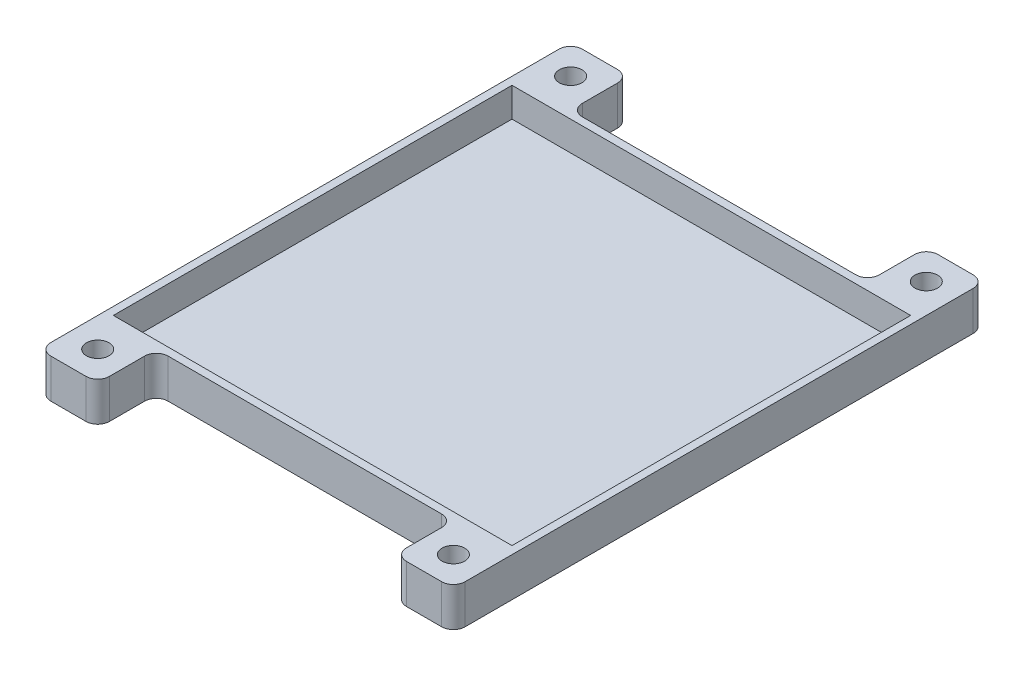
ISO-10303-21;
HEADER;
FILE_DESCRIPTION(('STEP AP214'),'2;1');
FILE_NAME('part.step','',(''),(''),'','','');
FILE_SCHEMA(('AUTOMOTIVE_DESIGN { 1 0 10303 214 1 1 1 1 }'));
ENDSEC;
DATA;
#1=APPLICATION_CONTEXT('core data for automotive mechanical design processes');
#2=APPLICATION_PROTOCOL_DEFINITION('international standard','automotive_design',2000,#1);
#3=PRODUCT_CONTEXT('',#1,'mechanical');
#4=PRODUCT('Part','Part','',(#3));
#5=PRODUCT_RELATED_PRODUCT_CATEGORY('part','',(#4));
#6=PRODUCT_DEFINITION_FORMATION('','',#4);
#7=PRODUCT_DEFINITION_CONTEXT('part definition',#1,'design');
#8=PRODUCT_DEFINITION('design','',#6,#7);
#9=PRODUCT_DEFINITION_SHAPE('','',#8);
#10=(LENGTH_UNIT() NAMED_UNIT(*) SI_UNIT(.MILLI.,.METRE.));
#11=(NAMED_UNIT(*) PLANE_ANGLE_UNIT() SI_UNIT($,.RADIAN.));
#12=(NAMED_UNIT(*) SI_UNIT($,.STERADIAN.) SOLID_ANGLE_UNIT());
#13=UNCERTAINTY_MEASURE_WITH_UNIT(LENGTH_MEASURE(1.E-05),#10,'distance_accuracy_value','');
#14=(GEOMETRIC_REPRESENTATION_CONTEXT(3) GLOBAL_UNCERTAINTY_ASSIGNED_CONTEXT((#13)) GLOBAL_UNIT_ASSIGNED_CONTEXT((#10,
#11,#12)) REPRESENTATION_CONTEXT('',''));
#15=CARTESIAN_POINT('',(0.,0.,0.));
#16=DIRECTION('',(0.,0.,1.));
#17=DIRECTION('',(1.,0.,0.));
#18=AXIS2_PLACEMENT_3D('',#15,#16,#17);
#19=CARTESIAN_POINT('',(-53.,-8.5,-51.));
#20=DIRECTION('',(0.,0.,-1.));
#21=DIRECTION('',(-1.,0.,0.));
#22=AXIS2_PLACEMENT_3D('',#19,#20,#21);
#23=PLANE('',#22);
#24=DIRECTION('',(1.,0.,0.));
#25=VECTOR('',#24,1.);
#26=CARTESIAN_POINT('',(51.,-6.00000000000001,-51.));
#27=LINE('',#26,#25);
#28=CARTESIAN_POINT('',(-51.,-6.,-51.));
#29=VERTEX_POINT('',#28);
#30=CARTESIAN_POINT('',(51.,-6.00000000000001,-51.));
#31=VERTEX_POINT('',#30);
#32=EDGE_CURVE('E445',#29,#31,#27,.T.);
#33=ORIENTED_EDGE('',*,*,#32,.T.);
#34=DIRECTION('',(0.,1.,0.));
#35=VECTOR('',#34,1.);
#36=CARTESIAN_POINT('',(51.,-8.5,-51.));
#37=LINE('',#36,#35);
#38=CARTESIAN_POINT('',(51.,1.5,-51.));
#39=VERTEX_POINT('',#38);
#40=EDGE_CURVE('E431',#31,#39,#37,.T.);
#41=ORIENTED_EDGE('',*,*,#40,.T.);
#42=DIRECTION('',(-1.,0.,0.));
#43=VECTOR('',#42,1.);
#44=CARTESIAN_POINT('',(51.,1.5,-51.));
#45=LINE('',#44,#43);
#46=CARTESIAN_POINT('',(-51.,1.5,-51.));
#47=VERTEX_POINT('',#46);
#48=EDGE_CURVE('E469',#39,#47,#45,.T.);
#49=ORIENTED_EDGE('',*,*,#48,.T.);
#50=DIRECTION('',(0.,1.,0.));
#51=VECTOR('',#50,1.);
#52=CARTESIAN_POINT('',(-51.,-8.5,-51.));
#53=LINE('',#52,#51);
#54=EDGE_CURVE('E441',#29,#47,#53,.T.);
#55=ORIENTED_EDGE('',*,*,#54,.F.);
#56=EDGE_LOOP('',(#33,#41,#49,#55));
#57=FACE_BOUND('',#56,.T.);
#58=ADVANCED_FACE('F247',(#57),#23,.F.);
#59=CARTESIAN_POINT('',(-51.,-8.5,53.));
#60=DIRECTION('',(-1.,0.,0.));
#61=DIRECTION('',(0.,0.,1.));
#62=AXIS2_PLACEMENT_3D('',#59,#60,#61);
#63=PLANE('',#62);
#64=DIRECTION('',(0.,0.,-1.));
#65=VECTOR('',#64,1.);
#66=CARTESIAN_POINT('',(-51.,-6.00000000000001,-51.));
#67=LINE('',#66,#65);
#68=CARTESIAN_POINT('',(-51.,-6.,51.));
#69=VERTEX_POINT('',#68);
#70=EDGE_CURVE('E262',#69,#29,#67,.T.);
#71=ORIENTED_EDGE('',*,*,#70,.T.);
#72=ORIENTED_EDGE('',*,*,#54,.T.);
#73=DIRECTION('',(0.,0.,1.));
#74=VECTOR('',#73,1.);
#75=CARTESIAN_POINT('',(-51.,1.5,-51.));
#76=LINE('',#75,#74);
#77=CARTESIAN_POINT('',(-51.,1.5,51.));
#78=VERTEX_POINT('',#77);
#79=EDGE_CURVE('E471',#47,#78,#76,.T.);
#80=ORIENTED_EDGE('',*,*,#79,.T.);
#81=DIRECTION('',(0.,1.,0.));
#82=VECTOR('',#81,1.);
#83=CARTESIAN_POINT('',(-51.,-8.5,51.));
#84=LINE('',#83,#82);
#85=EDGE_CURVE('E547',#69,#78,#84,.T.);
#86=ORIENTED_EDGE('',*,*,#85,.F.);
#87=EDGE_LOOP('',(#71,#72,#80,#86));
#88=FACE_BOUND('',#87,.T.);
#89=ADVANCED_FACE('F788',(#88),#63,.F.);
#90=CARTESIAN_POINT('',(-53.,-8.5,51.));
#91=DIRECTION('',(0.,0.,1.));
#92=DIRECTION('',(1.,0.,0.));
#93=AXIS2_PLACEMENT_3D('',#90,#91,#92);
#94=PLANE('',#93);
#95=DIRECTION('',(-1.,0.,0.));
#96=VECTOR('',#95,1.);
#97=CARTESIAN_POINT('',(-51.,-6.00000000000001,51.));
#98=LINE('',#97,#96);
#99=CARTESIAN_POINT('',(51.,-6.,51.));
#100=VERTEX_POINT('',#99);
#101=EDGE_CURVE('E270',#100,#69,#98,.T.);
#102=ORIENTED_EDGE('',*,*,#101,.T.);
#103=ORIENTED_EDGE('',*,*,#85,.T.);
#104=DIRECTION('',(1.,0.,0.));
#105=VECTOR('',#104,1.);
#106=CARTESIAN_POINT('',(-51.,1.5,51.));
#107=LINE('',#106,#105);
#108=CARTESIAN_POINT('',(51.,1.5,51.));
#109=VERTEX_POINT('',#108);
#110=EDGE_CURVE('E465',#78,#109,#107,.T.);
#111=ORIENTED_EDGE('',*,*,#110,.T.);
#112=DIRECTION('',(0.,1.,0.));
#113=VECTOR('',#112,1.);
#114=CARTESIAN_POINT('',(51.,-8.5,51.));
#115=LINE('',#114,#113);
#116=EDGE_CURVE('E545',#100,#109,#115,.T.);
#117=ORIENTED_EDGE('',*,*,#116,.F.);
#118=EDGE_LOOP('',(#102,#103,#111,#117));
#119=FACE_BOUND('',#118,.T.);
#120=ADVANCED_FACE('F794',(#119),#94,.F.);
#121=CARTESIAN_POINT('',(51.,-8.5,53.));
#122=DIRECTION('',(1.,0.,0.));
#123=DIRECTION('',(0.,0.,-1.));
#124=AXIS2_PLACEMENT_3D('',#121,#122,#123);
#125=PLANE('',#124);
#126=DIRECTION('',(0.,0.,1.));
#127=VECTOR('',#126,1.);
#128=CARTESIAN_POINT('',(51.,-6.00000000000001,51.));
#129=LINE('',#128,#127);
#130=EDGE_CURVE('E435',#31,#100,#129,.T.);
#131=ORIENTED_EDGE('',*,*,#130,.T.);
#132=ORIENTED_EDGE('',*,*,#116,.T.);
#133=DIRECTION('',(0.,0.,-1.));
#134=VECTOR('',#133,1.);
#135=CARTESIAN_POINT('',(51.,1.5,51.));
#136=LINE('',#135,#134);
#137=EDGE_CURVE('E437',#109,#39,#136,.T.);
#138=ORIENTED_EDGE('',*,*,#137,.T.);
#139=ORIENTED_EDGE('',*,*,#40,.F.);
#140=EDGE_LOOP('',(#131,#132,#138,#139));
#141=FACE_BOUND('',#140,.T.);
#142=ADVANCED_FACE('F433',(#141),#125,.F.);
#143=CARTESIAN_POINT('',(-53.,-8.5,53.));
#144=DIRECTION('',(0.,0.,1.));
#145=DIRECTION('',(1.,0.,0.));
#146=AXIS2_PLACEMENT_3D('',#143,#144,#145);
#147=PLANE('',#146);
#148=DIRECTION('',(1.,0.,0.));
#149=VECTOR('',#148,1.);
#150=CARTESIAN_POINT('',(-53.,-8.5,53.));
#151=LINE('',#150,#149);
#152=CARTESIAN_POINT('',(-35.,-8.5,53.));
#153=VERTEX_POINT('',#152);
#154=CARTESIAN_POINT('',(35.,-8.5,53.));
#155=VERTEX_POINT('',#154);
#156=EDGE_CURVE('E559',#153,#155,#151,.T.);
#157=ORIENTED_EDGE('',*,*,#156,.T.);
#158=DIRECTION('',(0.,-1.,0.));
#159=VECTOR('',#158,1.);
#160=CARTESIAN_POINT('',(35.,-8.5,53.));
#161=LINE('',#160,#159);
#162=CARTESIAN_POINT('',(35.,1.5,53.));
#163=VERTEX_POINT('',#162);
#164=EDGE_CURVE('E652',#155,#163,#161,.F.);
#165=ORIENTED_EDGE('',*,*,#164,.T.);
#166=DIRECTION('',(1.,0.,0.));
#167=VECTOR('',#166,1.);
#168=CARTESIAN_POINT('',(-38.,1.5,53.));
#169=LINE('',#168,#167);
#170=CARTESIAN_POINT('',(-35.,1.5,53.));
#171=VERTEX_POINT('',#170);
#172=EDGE_CURVE('E477',#171,#163,#169,.T.);
#173=ORIENTED_EDGE('',*,*,#172,.F.);
#174=DIRECTION('',(0.,-1.,0.));
#175=VECTOR('',#174,1.);
#176=CARTESIAN_POINT('',(-35.,-8.5,53.));
#177=LINE('',#176,#175);
#178=EDGE_CURVE('E649',#171,#153,#177,.T.);
#179=ORIENTED_EDGE('',*,*,#178,.T.);
#180=EDGE_LOOP('',(#157,#165,#173,#179));
#181=FACE_BOUND('',#180,.T.);
#182=ADVANCED_FACE('F684',(#181),#147,.T.);
#183=CARTESIAN_POINT('',(-53.,-8.5,-53.));
#184=DIRECTION('',(0.,0.,-1.));
#185=DIRECTION('',(-1.,0.,0.));
#186=AXIS2_PLACEMENT_3D('',#183,#184,#185);
#187=PLANE('',#186);
#188=DIRECTION('',(-1.,0.,0.));
#189=VECTOR('',#188,1.);
#190=CARTESIAN_POINT('',(-53.,-8.5,-53.));
#191=LINE('',#190,#189);
#192=CARTESIAN_POINT('',(35.,-8.5,-53.));
#193=VERTEX_POINT('',#192);
#194=CARTESIAN_POINT('',(-35.,-8.5,-53.));
#195=VERTEX_POINT('',#194);
#196=EDGE_CURVE('E553',#193,#195,#191,.T.);
#197=ORIENTED_EDGE('',*,*,#196,.T.);
#198=DIRECTION('',(0.,-1.,0.));
#199=VECTOR('',#198,1.);
#200=CARTESIAN_POINT('',(-35.,-8.5,-53.));
#201=LINE('',#200,#199);
#202=CARTESIAN_POINT('',(-35.,1.5,-53.));
#203=VERTEX_POINT('',#202);
#204=EDGE_CURVE('E622',#195,#203,#201,.F.);
#205=ORIENTED_EDGE('',*,*,#204,.T.);
#206=DIRECTION('',(-1.,0.,0.));
#207=VECTOR('',#206,1.);
#208=CARTESIAN_POINT('',(38.,1.5,-53.));
#209=LINE('',#208,#207);
#210=CARTESIAN_POINT('',(35.,1.5,-53.));
#211=VERTEX_POINT('',#210);
#212=EDGE_CURVE('E495',#211,#203,#209,.T.);
#213=ORIENTED_EDGE('',*,*,#212,.F.);
#214=DIRECTION('',(0.,-1.,0.));
#215=VECTOR('',#214,1.);
#216=CARTESIAN_POINT('',(35.,-8.5,-53.));
#217=LINE('',#216,#215);
#218=EDGE_CURVE('E619',#211,#193,#217,.T.);
#219=ORIENTED_EDGE('',*,*,#218,.T.);
#220=EDGE_LOOP('',(#197,#205,#213,#219));
#221=FACE_BOUND('',#220,.T.);
#222=ADVANCED_FACE('F737',(#221),#187,.T.);
#223=CARTESIAN_POINT('',(53.,-8.5,53.));
#224=DIRECTION('',(1.,0.,0.));
#225=DIRECTION('',(0.,0.,-1.));
#226=AXIS2_PLACEMENT_3D('',#223,#224,#225);
#227=PLANE('',#226);
#228=DIRECTION('',(0.,0.,-1.));
#229=VECTOR('',#228,1.);
#230=CARTESIAN_POINT('',(53.,-8.5,53.));
#231=LINE('',#230,#229);
#232=CARTESIAN_POINT('',(53.,-8.5,65.));
#233=VERTEX_POINT('',#232);
#234=CARTESIAN_POINT('',(53.,-8.5,-65.));
#235=VERTEX_POINT('',#234);
#236=EDGE_CURVE('E546',#233,#235,#231,.T.);
#237=ORIENTED_EDGE('',*,*,#236,.T.);
#238=DIRECTION('',(0.,-1.,0.));
#239=VECTOR('',#238,1.);
#240=CARTESIAN_POINT('',(53.,1.5,-65.));
#241=LINE('',#240,#239);
#242=CARTESIAN_POINT('',(53.,1.5,-65.));
#243=VERTEX_POINT('',#242);
#244=EDGE_CURVE('E637',#235,#243,#241,.F.);
#245=ORIENTED_EDGE('',*,*,#244,.T.);
#246=DIRECTION('',(0.,0.,-1.));
#247=VECTOR('',#246,1.);
#248=CARTESIAN_POINT('',(53.,1.5,68.));
#249=LINE('',#248,#247);
#250=CARTESIAN_POINT('',(53.,1.5,65.));
#251=VERTEX_POINT('',#250);
#252=EDGE_CURVE('E486',#251,#243,#249,.T.);
#253=ORIENTED_EDGE('',*,*,#252,.F.);
#254=DIRECTION('',(0.,-1.,0.));
#255=VECTOR('',#254,1.);
#256=CARTESIAN_POINT('',(53.,-8.5,65.));
#257=LINE('',#256,#255);
#258=EDGE_CURVE('E634',#251,#233,#257,.T.);
#259=ORIENTED_EDGE('',*,*,#258,.T.);
#260=EDGE_LOOP('',(#237,#245,#253,#259));
#261=FACE_BOUND('',#260,.T.);
#262=ADVANCED_FACE('F710',(#261),#227,.T.);
#263=CARTESIAN_POINT('',(-53.,-8.5,53.));
#264=DIRECTION('',(-1.,0.,0.));
#265=DIRECTION('',(0.,0.,1.));
#266=AXIS2_PLACEMENT_3D('',#263,#264,#265);
#267=PLANE('',#266);
#268=DIRECTION('',(0.,0.,1.));
#269=VECTOR('',#268,1.);
#270=CARTESIAN_POINT('',(-53.,-8.5,53.));
#271=LINE('',#270,#269);
#272=CARTESIAN_POINT('',(-53.,-8.5,-65.));
#273=VERTEX_POINT('',#272);
#274=CARTESIAN_POINT('',(-53.,-8.5,65.));
#275=VERTEX_POINT('',#274);
#276=EDGE_CURVE('E556',#273,#275,#271,.T.);
#277=ORIENTED_EDGE('',*,*,#276,.T.);
#278=DIRECTION('',(0.,-1.,0.));
#279=VECTOR('',#278,1.);
#280=CARTESIAN_POINT('',(-53.,1.5,65.));
#281=LINE('',#280,#279);
#282=CARTESIAN_POINT('',(-53.,1.5,65.));
#283=VERTEX_POINT('',#282);
#284=EDGE_CURVE('E607',#275,#283,#281,.F.);
#285=ORIENTED_EDGE('',*,*,#284,.T.);
#286=DIRECTION('',(0.,0.,1.));
#287=VECTOR('',#286,1.);
#288=CARTESIAN_POINT('',(-53.,1.5,-68.));
#289=LINE('',#288,#287);
#290=CARTESIAN_POINT('',(-53.,1.5,-65.));
#291=VERTEX_POINT('',#290);
#292=EDGE_CURVE('E504',#291,#283,#289,.T.);
#293=ORIENTED_EDGE('',*,*,#292,.F.);
#294=DIRECTION('',(0.,-1.,0.));
#295=VECTOR('',#294,1.);
#296=CARTESIAN_POINT('',(-53.,-8.5,-65.));
#297=LINE('',#296,#295);
#298=EDGE_CURVE('E604',#291,#273,#297,.T.);
#299=ORIENTED_EDGE('',*,*,#298,.T.);
#300=EDGE_LOOP('',(#277,#285,#293,#299));
#301=FACE_BOUND('',#300,.T.);
#302=ADVANCED_FACE('F763',(#301),#267,.T.);
#303=CARTESIAN_POINT('',(0.,-8.5,0.));
#304=DIRECTION('',(0.,-1.,0.));
#305=DIRECTION('',(0.,0.,-1.));
#306=AXIS2_PLACEMENT_3D('',#303,#304,#305);
#307=PLANE('',#306);
#308=CARTESIAN_POINT('',(-45.5,-8.5,-60.5));
#309=DIRECTION('',(0.,1.,0.));
#310=DIRECTION('',(0.,0.,1.));
#311=AXIS2_PLACEMENT_3D('',#308,#309,#310);
#312=CIRCLE('',#311,2.9);
#313=CARTESIAN_POINT('',(-45.5,-8.5,-57.6));
#314=VERTEX_POINT('',#313);
#315=EDGE_CURVE('E510',#314,#314,#312,.T.);
#316=ORIENTED_EDGE('',*,*,#315,.T.);
#317=EDGE_LOOP('',(#316));
#318=FACE_BOUND('',#317,.T.);
#319=CARTESIAN_POINT('',(45.5,-8.5,-60.5));
#320=DIRECTION('',(0.,1.,0.));
#321=DIRECTION('',(0.,0.,1.));
#322=AXIS2_PLACEMENT_3D('',#319,#320,#321);
#323=CIRCLE('',#322,2.9);
#324=CARTESIAN_POINT('',(45.5,-8.5,-57.6));
#325=VERTEX_POINT('',#324);
#326=EDGE_CURVE('E513',#325,#325,#323,.T.);
#327=ORIENTED_EDGE('',*,*,#326,.T.);
#328=EDGE_LOOP('',(#327));
#329=FACE_BOUND('',#328,.T.);
#330=CARTESIAN_POINT('',(45.5,-8.5,60.5));
#331=DIRECTION('',(0.,1.,0.));
#332=DIRECTION('',(0.,0.,1.));
#333=AXIS2_PLACEMENT_3D('',#330,#331,#332);
#334=CIRCLE('',#333,2.9);
#335=CARTESIAN_POINT('',(45.5,-8.5,63.4));
#336=VERTEX_POINT('',#335);
#337=EDGE_CURVE('E516',#336,#336,#334,.T.);
#338=ORIENTED_EDGE('',*,*,#337,.T.);
#339=EDGE_LOOP('',(#338));
#340=FACE_BOUND('',#339,.T.);
#341=CARTESIAN_POINT('',(-45.5,-8.5,60.5));
#342=DIRECTION('',(0.,1.,0.));
#343=DIRECTION('',(0.,0.,1.));
#344=AXIS2_PLACEMENT_3D('',#341,#342,#343);
#345=CIRCLE('',#344,2.9);
#346=CARTESIAN_POINT('',(-45.5,-8.5,63.4));
#347=VERTEX_POINT('',#346);
#348=EDGE_CURVE('E519',#347,#347,#345,.T.);
#349=ORIENTED_EDGE('',*,*,#348,.T.);
#350=EDGE_LOOP('',(#349));
#351=FACE_BOUND('',#350,.T.);
#352=DIRECTION('',(0.,0.,-1.));
#353=VECTOR('',#352,1.);
#354=CARTESIAN_POINT('',(-38.,-8.5,68.));
#355=LINE('',#354,#353);
#356=CARTESIAN_POINT('',(-38.,-8.5,65.));
#357=VERTEX_POINT('',#356);
#358=CARTESIAN_POINT('',(-38.,-8.5,56.));
#359=VERTEX_POINT('',#358);
#360=EDGE_CURVE('E522',#357,#359,#355,.T.);
#361=ORIENTED_EDGE('',*,*,#360,.F.);
#362=CARTESIAN_POINT('',(-41.,-8.5,65.));
#363=DIRECTION('',(0.,-1.,0.));
#364=DIRECTION('',(0.,0.,-1.));
#365=AXIS2_PLACEMENT_3D('',#362,#363,#364);
#366=CIRCLE('',#365,3.);
#367=CARTESIAN_POINT('',(-41.,-8.5,68.));
#368=VERTEX_POINT('',#367);
#369=EDGE_CURVE('E581',#357,#368,#366,.T.);
#370=ORIENTED_EDGE('',*,*,#369,.T.);
#371=DIRECTION('',(1.,0.,0.));
#372=VECTOR('',#371,1.);
#373=CARTESIAN_POINT('',(-38.,-8.5,68.));
#374=LINE('',#373,#372);
#375=CARTESIAN_POINT('',(-50.,-8.5,68.));
#376=VERTEX_POINT('',#375);
#377=EDGE_CURVE('E536',#376,#368,#374,.T.);
#378=ORIENTED_EDGE('',*,*,#377,.F.);
#379=CARTESIAN_POINT('',(-50.,-8.5,65.));
#380=DIRECTION('',(0.,-1.,0.));
#381=DIRECTION('',(0.,0.,-1.));
#382=AXIS2_PLACEMENT_3D('',#379,#380,#381);
#383=CIRCLE('',#382,3.);
#384=EDGE_CURVE('E579',#376,#275,#383,.T.);
#385=ORIENTED_EDGE('',*,*,#384,.T.);
#386=ORIENTED_EDGE('',*,*,#276,.F.);
#387=CARTESIAN_POINT('',(-50.,-8.5,-65.));
#388=DIRECTION('',(0.,-1.,0.));
#389=DIRECTION('',(0.,0.,-1.));
#390=AXIS2_PLACEMENT_3D('',#387,#388,#389);
#391=CIRCLE('',#390,3.);
#392=CARTESIAN_POINT('',(-50.,-8.5,-68.));
#393=VERTEX_POINT('',#392);
#394=EDGE_CURVE('E567',#273,#393,#391,.T.);
#395=ORIENTED_EDGE('',*,*,#394,.T.);
#396=DIRECTION('',(-1.,0.,0.));
#397=VECTOR('',#396,1.);
#398=CARTESIAN_POINT('',(-38.,-8.5,-68.));
#399=LINE('',#398,#397);
#400=CARTESIAN_POINT('',(-41.,-8.5,-68.));
#401=VERTEX_POINT('',#400);
#402=EDGE_CURVE('E526',#401,#393,#399,.T.);
#403=ORIENTED_EDGE('',*,*,#402,.F.);
#404=CARTESIAN_POINT('',(-41.,-8.5,-65.));
#405=DIRECTION('',(0.,-1.,0.));
#406=DIRECTION('',(0.,0.,-1.));
#407=AXIS2_PLACEMENT_3D('',#404,#405,#406);
#408=CIRCLE('',#407,3.);
#409=CARTESIAN_POINT('',(-38.,-8.5,-65.));
#410=VERTEX_POINT('',#409);
#411=EDGE_CURVE('E577',#401,#410,#408,.T.);
#412=ORIENTED_EDGE('',*,*,#411,.T.);
#413=DIRECTION('',(0.,0.,-1.));
#414=VECTOR('',#413,1.);
#415=CARTESIAN_POINT('',(-38.,-8.5,-68.));
#416=LINE('',#415,#414);
#417=CARTESIAN_POINT('',(-38.,-8.5,-56.));
#418=VERTEX_POINT('',#417);
#419=EDGE_CURVE('E442',#418,#410,#416,.T.);
#420=ORIENTED_EDGE('',*,*,#419,.F.);
#421=CARTESIAN_POINT('',(-35.,-8.5,-56.));
#422=DIRECTION('',(0.,-1.,0.));
#423=DIRECTION('',(0.,0.,-1.));
#424=AXIS2_PLACEMENT_3D('',#421,#422,#423);
#425=CIRCLE('',#424,3.);
#426=EDGE_CURVE('E654',#418,#195,#425,.F.);
#427=ORIENTED_EDGE('',*,*,#426,.T.);
#428=ORIENTED_EDGE('',*,*,#196,.F.);
#429=CARTESIAN_POINT('',(35.,-8.5,-56.));
#430=DIRECTION('',(0.,-1.,0.));
#431=DIRECTION('',(0.,0.,-1.));
#432=AXIS2_PLACEMENT_3D('',#429,#430,#431);
#433=CIRCLE('',#432,3.);
#434=CARTESIAN_POINT('',(38.,-8.5,-56.));
#435=VERTEX_POINT('',#434);
#436=EDGE_CURVE('E658',#193,#435,#433,.F.);
#437=ORIENTED_EDGE('',*,*,#436,.T.);
#438=DIRECTION('',(0.,0.,1.));
#439=VECTOR('',#438,1.);
#440=CARTESIAN_POINT('',(38.,-8.5,-68.));
#441=LINE('',#440,#439);
#442=CARTESIAN_POINT('',(38.,-8.5,-65.));
#443=VERTEX_POINT('',#442);
#444=EDGE_CURVE('E527',#443,#435,#441,.T.);
#445=ORIENTED_EDGE('',*,*,#444,.F.);
#446=CARTESIAN_POINT('',(41.,-8.5,-65.));
#447=DIRECTION('',(0.,-1.,0.));
#448=DIRECTION('',(0.,0.,-1.));
#449=AXIS2_PLACEMENT_3D('',#446,#447,#448);
#450=CIRCLE('',#449,3.);
#451=CARTESIAN_POINT('',(41.,-8.5,-68.));
#452=VERTEX_POINT('',#451);
#453=EDGE_CURVE('E575',#443,#452,#450,.T.);
#454=ORIENTED_EDGE('',*,*,#453,.T.);
#455=DIRECTION('',(-1.,0.,0.));
#456=VECTOR('',#455,1.);
#457=CARTESIAN_POINT('',(38.,-8.5,-68.));
#458=LINE('',#457,#456);
#459=CARTESIAN_POINT('',(50.,-8.5,-68.));
#460=VERTEX_POINT('',#459);
#461=EDGE_CURVE('E523',#460,#452,#458,.T.);
#462=ORIENTED_EDGE('',*,*,#461,.F.);
#463=CARTESIAN_POINT('',(50.,-8.5,-65.));
#464=DIRECTION('',(0.,-1.,0.));
#465=DIRECTION('',(0.,0.,-1.));
#466=AXIS2_PLACEMENT_3D('',#463,#464,#465);
#467=CIRCLE('',#466,3.);
#468=EDGE_CURVE('E573',#460,#235,#467,.T.);
#469=ORIENTED_EDGE('',*,*,#468,.T.);
#470=ORIENTED_EDGE('',*,*,#236,.F.);
#471=CARTESIAN_POINT('',(50.,-8.5,65.));
#472=DIRECTION('',(0.,-1.,0.));
#473=DIRECTION('',(0.,0.,-1.));
#474=AXIS2_PLACEMENT_3D('',#471,#472,#473);
#475=CIRCLE('',#474,3.);
#476=CARTESIAN_POINT('',(50.,-8.5,68.));
#477=VERTEX_POINT('',#476);
#478=EDGE_CURVE('E571',#233,#477,#475,.T.);
#479=ORIENTED_EDGE('',*,*,#478,.T.);
#480=DIRECTION('',(1.,0.,0.));
#481=VECTOR('',#480,1.);
#482=CARTESIAN_POINT('',(38.,-8.5,68.));
#483=LINE('',#482,#481);
#484=CARTESIAN_POINT('',(41.,-8.5,68.));
#485=VERTEX_POINT('',#484);
#486=EDGE_CURVE('E533',#485,#477,#483,.T.);
#487=ORIENTED_EDGE('',*,*,#486,.F.);
#488=CARTESIAN_POINT('',(41.,-8.5,65.));
#489=DIRECTION('',(0.,-1.,0.));
#490=DIRECTION('',(0.,0.,-1.));
#491=AXIS2_PLACEMENT_3D('',#488,#489,#490);
#492=CIRCLE('',#491,3.);
#493=CARTESIAN_POINT('',(38.,-8.5,65.));
#494=VERTEX_POINT('',#493);
#495=EDGE_CURVE('E569',#485,#494,#492,.T.);
#496=ORIENTED_EDGE('',*,*,#495,.T.);
#497=DIRECTION('',(0.,0.,1.));
#498=VECTOR('',#497,1.);
#499=CARTESIAN_POINT('',(38.,-8.5,68.));
#500=LINE('',#499,#498);
#501=CARTESIAN_POINT('',(38.,-8.5,56.));
#502=VERTEX_POINT('',#501);
#503=EDGE_CURVE('E530',#502,#494,#500,.T.);
#504=ORIENTED_EDGE('',*,*,#503,.F.);
#505=CARTESIAN_POINT('',(35.,-8.5,56.));
#506=DIRECTION('',(0.,-1.,0.));
#507=DIRECTION('',(0.,0.,-1.));
#508=AXIS2_PLACEMENT_3D('',#505,#506,#507);
#509=CIRCLE('',#508,3.);
#510=EDGE_CURVE('E662',#502,#155,#509,.F.);
#511=ORIENTED_EDGE('',*,*,#510,.T.);
#512=ORIENTED_EDGE('',*,*,#156,.F.);
#513=CARTESIAN_POINT('',(-35.,-8.5,56.));
#514=DIRECTION('',(0.,-1.,0.));
#515=DIRECTION('',(0.,0.,-1.));
#516=AXIS2_PLACEMENT_3D('',#513,#514,#515);
#517=CIRCLE('',#516,3.);
#518=EDGE_CURVE('E255',#153,#359,#517,.F.);
#519=ORIENTED_EDGE('',*,*,#518,.T.);
#520=EDGE_LOOP('',(#361,#370,#378,#385,#386,#395,#403,#412,#420,#427,#428,#437,#445,#454,#462,
#469,#470,#479,#487,#496,#504,#511,#512,#519));
#521=FACE_BOUND('',#520,.T.);
#522=ADVANCED_FACE('F668',(#318,#329,#340,#351,#521),#307,.T.);
#523=CARTESIAN_POINT('',(-38.,21.2132034355964,-68.));
#524=DIRECTION('',(0.,0.,1.));
#525=DIRECTION('',(1.,0.,0.));
#526=AXIS2_PLACEMENT_3D('',#523,#524,#525);
#527=PLANE('',#526);
#528=DIRECTION('',(-1.,0.,0.));
#529=VECTOR('',#528,1.);
#530=CARTESIAN_POINT('',(-38.,1.5,-68.));
#531=LINE('',#530,#529);
#532=CARTESIAN_POINT('',(-41.,1.5,-68.));
#533=VERTEX_POINT('',#532);
#534=CARTESIAN_POINT('',(-50.,1.5,-68.));
#535=VERTEX_POINT('',#534);
#536=EDGE_CURVE('E501',#533,#535,#531,.T.);
#537=ORIENTED_EDGE('',*,*,#536,.F.);
#538=DIRECTION('',(0.,-1.,0.));
#539=VECTOR('',#538,1.);
#540=CARTESIAN_POINT('',(-41.,21.2132034355964,-68.));
#541=LINE('',#540,#539);
#542=EDGE_CURVE('E611',#533,#401,#541,.T.);
#543=ORIENTED_EDGE('',*,*,#542,.T.);
#544=ORIENTED_EDGE('',*,*,#402,.T.);
#545=DIRECTION('',(0.,-1.,0.));
#546=VECTOR('',#545,1.);
#547=CARTESIAN_POINT('',(-50.,1.5,-68.));
#548=LINE('',#547,#546);
#549=EDGE_CURVE('E609',#393,#535,#548,.F.);
#550=ORIENTED_EDGE('',*,*,#549,.T.);
#551=EDGE_LOOP('',(#537,#543,#544,#550));
#552=FACE_BOUND('',#551,.T.);
#553=ADVANCED_FACE('F755',(#552),#527,.F.);
#554=CARTESIAN_POINT('',(-38.,21.2132034355964,-68.));
#555=DIRECTION('',(-1.,0.,0.));
#556=DIRECTION('',(0.,0.,1.));
#557=AXIS2_PLACEMENT_3D('',#554,#555,#556);
#558=PLANE('',#557);
#559=ORIENTED_EDGE('',*,*,#419,.T.);
#560=DIRECTION('',(0.,-1.,0.));
#561=VECTOR('',#560,1.);
#562=CARTESIAN_POINT('',(-38.,21.2132034355964,-65.));
#563=LINE('',#562,#561);
#564=CARTESIAN_POINT('',(-38.,1.5,-65.));
#565=VERTEX_POINT('',#564);
#566=EDGE_CURVE('E617',#410,#565,#563,.F.);
#567=ORIENTED_EDGE('',*,*,#566,.T.);
#568=DIRECTION('',(0.,0.,-1.));
#569=VECTOR('',#568,1.);
#570=CARTESIAN_POINT('',(-38.,1.5,-53.));
#571=LINE('',#570,#569);
#572=CARTESIAN_POINT('',(-38.,1.5,-56.));
#573=VERTEX_POINT('',#572);
#574=EDGE_CURVE('E498',#573,#565,#571,.T.);
#575=ORIENTED_EDGE('',*,*,#574,.F.);
#576=DIRECTION('',(0.,-1.,0.));
#577=VECTOR('',#576,1.);
#578=CARTESIAN_POINT('',(-38.,21.2132034355964,-56.));
#579=LINE('',#578,#577);
#580=EDGE_CURVE('E614',#573,#418,#579,.T.);
#581=ORIENTED_EDGE('',*,*,#580,.T.);
#582=EDGE_LOOP('',(#559,#567,#575,#581));
#583=FACE_BOUND('',#582,.T.);
#584=ADVANCED_FACE('F746',(#583),#558,.F.);
#585=CARTESIAN_POINT('',(38.,21.2132034355964,-68.));
#586=DIRECTION('',(0.,0.,1.));
#587=DIRECTION('',(1.,0.,0.));
#588=AXIS2_PLACEMENT_3D('',#585,#586,#587);
#589=PLANE('',#588);
#590=ORIENTED_EDGE('',*,*,#461,.T.);
#591=DIRECTION('',(0.,-1.,0.));
#592=VECTOR('',#591,1.);
#593=CARTESIAN_POINT('',(41.,21.2132034355964,-68.));
#594=LINE('',#593,#592);
#595=CARTESIAN_POINT('',(41.,1.5,-68.));
#596=VERTEX_POINT('',#595);
#597=EDGE_CURVE('E632',#452,#596,#594,.F.);
#598=ORIENTED_EDGE('',*,*,#597,.T.);
#599=DIRECTION('',(-1.,0.,0.));
#600=VECTOR('',#599,1.);
#601=CARTESIAN_POINT('',(53.,1.5,-68.));
#602=LINE('',#601,#600);
#603=CARTESIAN_POINT('',(50.,1.5,-68.));
#604=VERTEX_POINT('',#603);
#605=EDGE_CURVE('E489',#604,#596,#602,.T.);
#606=ORIENTED_EDGE('',*,*,#605,.F.);
#607=DIRECTION('',(0.,-1.,0.));
#608=VECTOR('',#607,1.);
#609=CARTESIAN_POINT('',(50.,-8.5,-68.));
#610=LINE('',#609,#608);
#611=EDGE_CURVE('E629',#604,#460,#610,.T.);
#612=ORIENTED_EDGE('',*,*,#611,.T.);
#613=EDGE_LOOP('',(#590,#598,#606,#612));
#614=FACE_BOUND('',#613,.T.);
#615=ADVANCED_FACE('F719',(#614),#589,.F.);
#616=CARTESIAN_POINT('',(38.,21.2132034355964,-68.));
#617=DIRECTION('',(1.,0.,0.));
#618=DIRECTION('',(0.,0.,-1.));
#619=AXIS2_PLACEMENT_3D('',#616,#617,#618);
#620=PLANE('',#619);
#621=ORIENTED_EDGE('',*,*,#444,.T.);
#622=DIRECTION('',(0.,-1.,0.));
#623=VECTOR('',#622,1.);
#624=CARTESIAN_POINT('',(38.,21.2132034355964,-56.));
#625=LINE('',#624,#623);
#626=CARTESIAN_POINT('',(38.,1.5,-56.));
#627=VERTEX_POINT('',#626);
#628=EDGE_CURVE('E627',#435,#627,#625,.F.);
#629=ORIENTED_EDGE('',*,*,#628,.T.);
#630=DIRECTION('',(0.,0.,1.));
#631=VECTOR('',#630,1.);
#632=CARTESIAN_POINT('',(38.,1.5,-68.));
#633=LINE('',#632,#631);
#634=CARTESIAN_POINT('',(38.,1.5,-65.));
#635=VERTEX_POINT('',#634);
#636=EDGE_CURVE('E492',#635,#627,#633,.T.);
#637=ORIENTED_EDGE('',*,*,#636,.F.);
#638=DIRECTION('',(0.,-1.,0.));
#639=VECTOR('',#638,1.);
#640=CARTESIAN_POINT('',(38.,21.2132034355964,-65.));
#641=LINE('',#640,#639);
#642=EDGE_CURVE('E624',#635,#443,#641,.T.);
#643=ORIENTED_EDGE('',*,*,#642,.T.);
#644=EDGE_LOOP('',(#621,#629,#637,#643));
#645=FACE_BOUND('',#644,.T.);
#646=ADVANCED_FACE('F728',(#645),#620,.F.);
#647=CARTESIAN_POINT('',(38.,21.2132034355964,68.));
#648=DIRECTION('',(1.,0.,0.));
#649=DIRECTION('',(0.,0.,-1.));
#650=AXIS2_PLACEMENT_3D('',#647,#648,#649);
#651=PLANE('',#650);
#652=ORIENTED_EDGE('',*,*,#503,.T.);
#653=DIRECTION('',(0.,-1.,0.));
#654=VECTOR('',#653,1.);
#655=CARTESIAN_POINT('',(38.,21.2132034355964,65.));
#656=LINE('',#655,#654);
#657=CARTESIAN_POINT('',(38.,1.5,65.));
#658=VERTEX_POINT('',#657);
#659=EDGE_CURVE('E647',#494,#658,#656,.F.);
#660=ORIENTED_EDGE('',*,*,#659,.T.);
#661=DIRECTION('',(0.,0.,1.));
#662=VECTOR('',#661,1.);
#663=CARTESIAN_POINT('',(38.,1.5,53.));
#664=LINE('',#663,#662);
#665=CARTESIAN_POINT('',(38.,1.5,56.));
#666=VERTEX_POINT('',#665);
#667=EDGE_CURVE('E480',#666,#658,#664,.T.);
#668=ORIENTED_EDGE('',*,*,#667,.F.);
#669=DIRECTION('',(0.,-1.,0.));
#670=VECTOR('',#669,1.);
#671=CARTESIAN_POINT('',(38.,21.2132034355964,56.));
#672=LINE('',#671,#670);
#673=EDGE_CURVE('E644',#666,#502,#672,.T.);
#674=ORIENTED_EDGE('',*,*,#673,.T.);
#675=EDGE_LOOP('',(#652,#660,#668,#674));
#676=FACE_BOUND('',#675,.T.);
#677=ADVANCED_FACE('F692',(#676),#651,.F.);
#678=CARTESIAN_POINT('',(38.,21.2132034355964,68.));
#679=DIRECTION('',(0.,0.,-1.));
#680=DIRECTION('',(-1.,0.,0.));
#681=AXIS2_PLACEMENT_3D('',#678,#679,#680);
#682=PLANE('',#681);
#683=ORIENTED_EDGE('',*,*,#486,.T.);
#684=DIRECTION('',(0.,-1.,0.));
#685=VECTOR('',#684,1.);
#686=CARTESIAN_POINT('',(50.,1.5,68.));
#687=LINE('',#686,#685);
#688=CARTESIAN_POINT('',(50.,1.5,68.));
#689=VERTEX_POINT('',#688);
#690=EDGE_CURVE('E642',#477,#689,#687,.F.);
#691=ORIENTED_EDGE('',*,*,#690,.T.);
#692=DIRECTION('',(1.,0.,0.));
#693=VECTOR('',#692,1.);
#694=CARTESIAN_POINT('',(38.,1.5,68.));
#695=LINE('',#694,#693);
#696=CARTESIAN_POINT('',(41.,1.5,68.));
#697=VERTEX_POINT('',#696);
#698=EDGE_CURVE('E483',#697,#689,#695,.T.);
#699=ORIENTED_EDGE('',*,*,#698,.F.);
#700=DIRECTION('',(0.,-1.,0.));
#701=VECTOR('',#700,1.);
#702=CARTESIAN_POINT('',(41.,21.2132034355964,68.));
#703=LINE('',#702,#701);
#704=EDGE_CURVE('E639',#697,#485,#703,.T.);
#705=ORIENTED_EDGE('',*,*,#704,.T.);
#706=EDGE_LOOP('',(#683,#691,#699,#705));
#707=FACE_BOUND('',#706,.T.);
#708=ADVANCED_FACE('F701',(#707),#682,.F.);
#709=CARTESIAN_POINT('',(-38.,21.2132034355964,68.));
#710=DIRECTION('',(0.,0.,-1.));
#711=DIRECTION('',(-1.,0.,0.));
#712=AXIS2_PLACEMENT_3D('',#709,#710,#711);
#713=PLANE('',#712);
#714=ORIENTED_EDGE('',*,*,#377,.T.);
#715=DIRECTION('',(0.,-1.,0.));
#716=VECTOR('',#715,1.);
#717=CARTESIAN_POINT('',(-41.,21.2132034355964,68.));
#718=LINE('',#717,#716);
#719=CARTESIAN_POINT('',(-41.,1.5,68.));
#720=VERTEX_POINT('',#719);
#721=EDGE_CURVE('E586',#368,#720,#718,.F.);
#722=ORIENTED_EDGE('',*,*,#721,.T.);
#723=DIRECTION('',(1.,0.,0.));
#724=VECTOR('',#723,1.);
#725=CARTESIAN_POINT('',(-53.,1.5,68.));
#726=LINE('',#725,#724);
#727=CARTESIAN_POINT('',(-50.,1.5,68.));
#728=VERTEX_POINT('',#727);
#729=EDGE_CURVE('E507',#728,#720,#726,.T.);
#730=ORIENTED_EDGE('',*,*,#729,.F.);
#731=DIRECTION('',(0.,-1.,0.));
#732=VECTOR('',#731,1.);
#733=CARTESIAN_POINT('',(-50.,-8.5,68.));
#734=LINE('',#733,#732);
#735=EDGE_CURVE('E583',#728,#376,#734,.T.);
#736=ORIENTED_EDGE('',*,*,#735,.T.);
#737=EDGE_LOOP('',(#714,#722,#730,#736));
#738=FACE_BOUND('',#737,.T.);
#739=ADVANCED_FACE('F772',(#738),#713,.F.);
#740=CARTESIAN_POINT('',(-38.,21.2132034355964,68.));
#741=DIRECTION('',(-1.,0.,0.));
#742=DIRECTION('',(0.,0.,1.));
#743=AXIS2_PLACEMENT_3D('',#740,#741,#742);
#744=PLANE('',#743);
#745=DIRECTION('',(0.,0.,-1.));
#746=VECTOR('',#745,1.);
#747=CARTESIAN_POINT('',(-38.,1.5,68.));
#748=LINE('',#747,#746);
#749=CARTESIAN_POINT('',(-38.,1.5,65.));
#750=VERTEX_POINT('',#749);
#751=CARTESIAN_POINT('',(-38.,1.5,56.));
#752=VERTEX_POINT('',#751);
#753=EDGE_CURVE('E474',#750,#752,#748,.T.);
#754=ORIENTED_EDGE('',*,*,#753,.F.);
#755=DIRECTION('',(0.,-1.,0.));
#756=VECTOR('',#755,1.);
#757=CARTESIAN_POINT('',(-38.,21.2132034355964,65.));
#758=LINE('',#757,#756);
#759=EDGE_CURVE('E564',#750,#357,#758,.T.);
#760=ORIENTED_EDGE('',*,*,#759,.T.);
#761=ORIENTED_EDGE('',*,*,#360,.T.);
#762=DIRECTION('',(0.,-1.,0.));
#763=VECTOR('',#762,1.);
#764=CARTESIAN_POINT('',(-38.,21.2132034355964,56.));
#765=LINE('',#764,#763);
#766=EDGE_CURVE('E562',#359,#752,#765,.F.);
#767=ORIENTED_EDGE('',*,*,#766,.T.);
#768=EDGE_LOOP('',(#754,#760,#761,#767));
#769=FACE_BOUND('',#768,.T.);
#770=ADVANCED_FACE('F674',(#769),#744,.F.);
#771=CARTESIAN_POINT('',(-45.5,0.,60.5));
#772=DIRECTION('',(0.,1.,0.));
#773=DIRECTION('',(0.,0.,1.));
#774=AXIS2_PLACEMENT_3D('',#771,#772,#773);
#775=CYLINDRICAL_SURFACE('',#774,2.89999999999999);
#776=ORIENTED_EDGE('',*,*,#348,.F.);
#777=EDGE_LOOP('',(#776));
#778=FACE_BOUND('',#777,.T.);
#779=CARTESIAN_POINT('',(-45.5,1.5,60.5));
#780=DIRECTION('',(0.,1.,0.));
#781=DIRECTION('',(0.,0.,1.));
#782=AXIS2_PLACEMENT_3D('',#779,#780,#781);
#783=CIRCLE('',#782,2.9);
#784=CARTESIAN_POINT('',(-45.5,1.5,63.4));
#785=VERTEX_POINT('',#784);
#786=EDGE_CURVE('E462',#785,#785,#783,.T.);
#787=ORIENTED_EDGE('',*,*,#786,.T.);
#788=EDGE_LOOP('',(#787));
#789=FACE_BOUND('',#788,.T.);
#790=ADVANCED_FACE('F876',(#778,#789),#775,.F.);
#791=CARTESIAN_POINT('',(45.5,0.,60.5));
#792=DIRECTION('',(0.,1.,0.));
#793=DIRECTION('',(0.,0.,1.));
#794=AXIS2_PLACEMENT_3D('',#791,#792,#793);
#795=CYLINDRICAL_SURFACE('',#794,2.89999999999999);
#796=ORIENTED_EDGE('',*,*,#337,.F.);
#797=EDGE_LOOP('',(#796));
#798=FACE_BOUND('',#797,.T.);
#799=CARTESIAN_POINT('',(45.5,1.5,60.5));
#800=DIRECTION('',(0.,1.,0.));
#801=DIRECTION('',(0.,0.,1.));
#802=AXIS2_PLACEMENT_3D('',#799,#800,#801);
#803=CIRCLE('',#802,2.89999999999998);
#804=CARTESIAN_POINT('',(45.5,1.5,63.4));
#805=VERTEX_POINT('',#804);
#806=EDGE_CURVE('E452',#805,#805,#803,.T.);
#807=ORIENTED_EDGE('',*,*,#806,.T.);
#808=EDGE_LOOP('',(#807));
#809=FACE_BOUND('',#808,.T.);
#810=ADVANCED_FACE('F1033',(#798,#809),#795,.F.);
#811=CARTESIAN_POINT('',(45.5,0.,-60.5));
#812=DIRECTION('',(0.,1.,0.));
#813=DIRECTION('',(0.,0.,1.));
#814=AXIS2_PLACEMENT_3D('',#811,#812,#813);
#815=CYLINDRICAL_SURFACE('',#814,2.89999999999999);
#816=ORIENTED_EDGE('',*,*,#326,.F.);
#817=EDGE_LOOP('',(#816));
#818=FACE_BOUND('',#817,.T.);
#819=CARTESIAN_POINT('',(45.5,1.5,-60.5));
#820=DIRECTION('',(0.,1.,0.));
#821=DIRECTION('',(0.,0.,1.));
#822=AXIS2_PLACEMENT_3D('',#819,#820,#821);
#823=CIRCLE('',#822,2.89999999999997);
#824=CARTESIAN_POINT('',(45.5,1.5,-57.6));
#825=VERTEX_POINT('',#824);
#826=EDGE_CURVE('E456',#825,#825,#823,.T.);
#827=ORIENTED_EDGE('',*,*,#826,.T.);
#828=EDGE_LOOP('',(#827));
#829=FACE_BOUND('',#828,.T.);
#830=ADVANCED_FACE('F1029',(#818,#829),#815,.F.);
#831=CARTESIAN_POINT('',(-45.5,0.,-60.5));
#832=DIRECTION('',(0.,1.,0.));
#833=DIRECTION('',(0.,0.,1.));
#834=AXIS2_PLACEMENT_3D('',#831,#832,#833);
#835=CYLINDRICAL_SURFACE('',#834,2.89999999999999);
#836=ORIENTED_EDGE('',*,*,#315,.F.);
#837=EDGE_LOOP('',(#836));
#838=FACE_BOUND('',#837,.T.);
#839=CARTESIAN_POINT('',(-45.5,1.5,-60.5));
#840=DIRECTION('',(0.,1.,0.));
#841=DIRECTION('',(0.,0.,1.));
#842=AXIS2_PLACEMENT_3D('',#839,#840,#841);
#843=CIRCLE('',#842,2.89999999999999);
#844=CARTESIAN_POINT('',(-45.5,1.5,-57.6));
#845=VERTEX_POINT('',#844);
#846=EDGE_CURVE('E459',#845,#845,#843,.T.);
#847=ORIENTED_EDGE('',*,*,#846,.T.);
#848=EDGE_LOOP('',(#847));
#849=FACE_BOUND('',#848,.T.);
#850=ADVANCED_FACE('F784',(#838,#849),#835,.F.);
#851=CARTESIAN_POINT('',(0.,1.5,0.));
#852=DIRECTION('',(0.,-1.,0.));
#853=DIRECTION('',(0.,0.,-1.));
#854=AXIS2_PLACEMENT_3D('',#851,#852,#853);
#855=PLANE('',#854);
#856=ORIENTED_EDGE('',*,*,#729,.T.);
#857=CARTESIAN_POINT('',(-41.,1.5,65.));
#858=DIRECTION('',(0.,-1.,0.));
#859=DIRECTION('',(0.,0.,-1.));
#860=AXIS2_PLACEMENT_3D('',#857,#858,#859);
#861=CIRCLE('',#860,3.);
#862=EDGE_CURVE('E602',#720,#750,#861,.F.);
#863=ORIENTED_EDGE('',*,*,#862,.T.);
#864=ORIENTED_EDGE('',*,*,#753,.T.);
#865=CARTESIAN_POINT('',(-35.,1.5,56.));
#866=DIRECTION('',(0.,-1.,0.));
#867=DIRECTION('',(0.,0.,-1.));
#868=AXIS2_PLACEMENT_3D('',#865,#866,#867);
#869=CIRCLE('',#868,3.);
#870=EDGE_CURVE('E13',#752,#171,#869,.T.);
#871=ORIENTED_EDGE('',*,*,#870,.T.);
#872=ORIENTED_EDGE('',*,*,#172,.T.);
#873=CARTESIAN_POINT('',(35.,1.5,56.));
#874=DIRECTION('',(0.,-1.,0.));
#875=DIRECTION('',(0.,0.,-1.));
#876=AXIS2_PLACEMENT_3D('',#873,#874,#875);
#877=CIRCLE('',#876,3.);
#878=EDGE_CURVE('E664',#163,#666,#877,.T.);
#879=ORIENTED_EDGE('',*,*,#878,.T.);
#880=ORIENTED_EDGE('',*,*,#667,.T.);
#881=CARTESIAN_POINT('',(41.,1.5,65.));
#882=DIRECTION('',(0.,-1.,0.));
#883=DIRECTION('',(0.,0.,-1.));
#884=AXIS2_PLACEMENT_3D('',#881,#882,#883);
#885=CIRCLE('',#884,3.);
#886=EDGE_CURVE('E590',#658,#697,#885,.F.);
#887=ORIENTED_EDGE('',*,*,#886,.T.);
#888=ORIENTED_EDGE('',*,*,#698,.T.);
#889=CARTESIAN_POINT('',(50.,1.5,65.));
#890=DIRECTION('',(0.,-1.,0.));
#891=DIRECTION('',(0.,0.,-1.));
#892=AXIS2_PLACEMENT_3D('',#889,#890,#891);
#893=CIRCLE('',#892,3.);
#894=EDGE_CURVE('E592',#689,#251,#893,.F.);
#895=ORIENTED_EDGE('',*,*,#894,.T.);
#896=ORIENTED_EDGE('',*,*,#252,.T.);
#897=CARTESIAN_POINT('',(50.,1.5,-65.));
#898=DIRECTION('',(0.,-1.,0.));
#899=DIRECTION('',(0.,0.,-1.));
#900=AXIS2_PLACEMENT_3D('',#897,#898,#899);
#901=CIRCLE('',#900,3.);
#902=EDGE_CURVE('E594',#243,#604,#901,.F.);
#903=ORIENTED_EDGE('',*,*,#902,.T.);
#904=ORIENTED_EDGE('',*,*,#605,.T.);
#905=CARTESIAN_POINT('',(41.,1.5,-65.));
#906=DIRECTION('',(0.,-1.,0.));
#907=DIRECTION('',(0.,0.,-1.));
#908=AXIS2_PLACEMENT_3D('',#905,#906,#907);
#909=CIRCLE('',#908,3.);
#910=EDGE_CURVE('E596',#596,#635,#909,.F.);
#911=ORIENTED_EDGE('',*,*,#910,.T.);
#912=ORIENTED_EDGE('',*,*,#636,.T.);
#913=CARTESIAN_POINT('',(35.,1.5,-56.));
#914=DIRECTION('',(0.,-1.,0.));
#915=DIRECTION('',(0.,0.,-1.));
#916=AXIS2_PLACEMENT_3D('',#913,#914,#915);
#917=CIRCLE('',#916,3.);
#918=EDGE_CURVE('E660',#627,#211,#917,.T.);
#919=ORIENTED_EDGE('',*,*,#918,.T.);
#920=ORIENTED_EDGE('',*,*,#212,.T.);
#921=CARTESIAN_POINT('',(-35.,1.5,-56.));
#922=DIRECTION('',(0.,-1.,0.));
#923=DIRECTION('',(0.,0.,-1.));
#924=AXIS2_PLACEMENT_3D('',#921,#922,#923);
#925=CIRCLE('',#924,3.);
#926=EDGE_CURVE('E656',#203,#573,#925,.T.);
#927=ORIENTED_EDGE('',*,*,#926,.T.);
#928=ORIENTED_EDGE('',*,*,#574,.T.);
#929=CARTESIAN_POINT('',(-41.,1.5,-65.));
#930=DIRECTION('',(0.,-1.,0.));
#931=DIRECTION('',(0.,0.,-1.));
#932=AXIS2_PLACEMENT_3D('',#929,#930,#931);
#933=CIRCLE('',#932,3.);
#934=EDGE_CURVE('E598',#565,#533,#933,.F.);
#935=ORIENTED_EDGE('',*,*,#934,.T.);
#936=ORIENTED_EDGE('',*,*,#536,.T.);
#937=CARTESIAN_POINT('',(-50.,1.5,-65.));
#938=DIRECTION('',(0.,-1.,0.));
#939=DIRECTION('',(0.,0.,-1.));
#940=AXIS2_PLACEMENT_3D('',#937,#938,#939);
#941=CIRCLE('',#940,3.);
#942=EDGE_CURVE('E588',#535,#291,#941,.F.);
#943=ORIENTED_EDGE('',*,*,#942,.T.);
#944=ORIENTED_EDGE('',*,*,#292,.T.);
#945=CARTESIAN_POINT('',(-50.,1.5,65.));
#946=DIRECTION('',(0.,-1.,0.));
#947=DIRECTION('',(0.,0.,-1.));
#948=AXIS2_PLACEMENT_3D('',#945,#946,#947);
#949=CIRCLE('',#948,3.);
#950=EDGE_CURVE('E600',#283,#728,#949,.F.);
#951=ORIENTED_EDGE('',*,*,#950,.T.);
#952=EDGE_LOOP('',(#856,#863,#864,#871,#872,#879,#880,#887,#888,#895,#896,#903,#904,#911,#912,
#919,#920,#927,#928,#935,#936,#943,#944,#951));
#953=FACE_BOUND('',#952,.T.);
#954=ORIENTED_EDGE('',*,*,#110,.F.);
#955=ORIENTED_EDGE('',*,*,#79,.F.);
#956=ORIENTED_EDGE('',*,*,#48,.F.);
#957=ORIENTED_EDGE('',*,*,#137,.F.);
#958=EDGE_LOOP('',(#954,#955,#956,#957));
#959=FACE_BOUND('',#958,.T.);
#960=ORIENTED_EDGE('',*,*,#786,.F.);
#961=EDGE_LOOP('',(#960));
#962=FACE_BOUND('',#961,.T.);
#963=ORIENTED_EDGE('',*,*,#846,.F.);
#964=EDGE_LOOP('',(#963));
#965=FACE_BOUND('',#964,.T.);
#966=ORIENTED_EDGE('',*,*,#826,.F.);
#967=EDGE_LOOP('',(#966));
#968=FACE_BOUND('',#967,.T.);
#969=ORIENTED_EDGE('',*,*,#806,.F.);
#970=EDGE_LOOP('',(#969));
#971=FACE_BOUND('',#970,.T.);
#972=ADVANCED_FACE('F680',(#953,#959,#962,#965,#968,#971),#855,.F.);
#973=CARTESIAN_POINT('',(-41.,21.2132034355964,65.));
#974=DIRECTION('',(0.,-1.,0.));
#975=DIRECTION('',(0.,0.,-1.));
#976=AXIS2_PLACEMENT_3D('',#973,#974,#975);
#977=CYLINDRICAL_SURFACE('',#976,3.);
#978=ORIENTED_EDGE('',*,*,#862,.F.);
#979=ORIENTED_EDGE('',*,*,#721,.F.);
#980=ORIENTED_EDGE('',*,*,#369,.F.);
#981=ORIENTED_EDGE('',*,*,#759,.F.);
#982=EDGE_LOOP('',(#978,#979,#980,#981));
#983=FACE_BOUND('',#982,.T.);
#984=ADVANCED_FACE('F776',(#983),#977,.T.);
#985=CARTESIAN_POINT('',(-50.,21.2132034355964,65.));
#986=DIRECTION('',(0.,1.,0.));
#987=DIRECTION('',(0.,0.,1.));
#988=AXIS2_PLACEMENT_3D('',#985,#986,#987);
#989=CYLINDRICAL_SURFACE('',#988,3.);
#990=ORIENTED_EDGE('',*,*,#950,.F.);
#991=ORIENTED_EDGE('',*,*,#284,.F.);
#992=ORIENTED_EDGE('',*,*,#384,.F.);
#993=ORIENTED_EDGE('',*,*,#735,.F.);
#994=EDGE_LOOP('',(#990,#991,#992,#993));
#995=FACE_BOUND('',#994,.T.);
#996=ADVANCED_FACE('F767',(#995),#989,.T.);
#997=CARTESIAN_POINT('',(-41.,21.2132034355964,-65.));
#998=DIRECTION('',(0.,-1.,0.));
#999=DIRECTION('',(0.,0.,-1.));
#1000=AXIS2_PLACEMENT_3D('',#997,#998,#999);
#1001=CYLINDRICAL_SURFACE('',#1000,3.);
#1002=ORIENTED_EDGE('',*,*,#934,.F.);
#1003=ORIENTED_EDGE('',*,*,#566,.F.);
#1004=ORIENTED_EDGE('',*,*,#411,.F.);
#1005=ORIENTED_EDGE('',*,*,#542,.F.);
#1006=EDGE_LOOP('',(#1002,#1003,#1004,#1005));
#1007=FACE_BOUND('',#1006,.T.);
#1008=ADVANCED_FACE('F750',(#1007),#1001,.T.);
#1009=CARTESIAN_POINT('',(-35.,21.2132034355964,-56.));
#1010=DIRECTION('',(0.,-1.,0.));
#1011=DIRECTION('',(0.,0.,-1.));
#1012=AXIS2_PLACEMENT_3D('',#1009,#1010,#1011);
#1013=CYLINDRICAL_SURFACE('',#1012,3.);
#1014=ORIENTED_EDGE('',*,*,#926,.F.);
#1015=ORIENTED_EDGE('',*,*,#204,.F.);
#1016=ORIENTED_EDGE('',*,*,#426,.F.);
#1017=ORIENTED_EDGE('',*,*,#580,.F.);
#1018=EDGE_LOOP('',(#1014,#1015,#1016,#1017));
#1019=FACE_BOUND('',#1018,.T.);
#1020=ADVANCED_FACE('F741',(#1019),#1013,.F.);
#1021=CARTESIAN_POINT('',(35.,-8.5,-56.));
#1022=DIRECTION('',(0.,-1.,0.));
#1023=DIRECTION('',(0.,0.,-1.));
#1024=AXIS2_PLACEMENT_3D('',#1021,#1022,#1023);
#1025=CYLINDRICAL_SURFACE('',#1024,3.);
#1026=ORIENTED_EDGE('',*,*,#918,.F.);
#1027=ORIENTED_EDGE('',*,*,#628,.F.);
#1028=ORIENTED_EDGE('',*,*,#436,.F.);
#1029=ORIENTED_EDGE('',*,*,#218,.F.);
#1030=EDGE_LOOP('',(#1026,#1027,#1028,#1029));
#1031=FACE_BOUND('',#1030,.T.);
#1032=ADVANCED_FACE('F732',(#1031),#1025,.F.);
#1033=CARTESIAN_POINT('',(41.,21.2132034355964,-65.));
#1034=DIRECTION('',(0.,-1.,0.));
#1035=DIRECTION('',(0.,0.,-1.));
#1036=AXIS2_PLACEMENT_3D('',#1033,#1034,#1035);
#1037=CYLINDRICAL_SURFACE('',#1036,3.);
#1038=ORIENTED_EDGE('',*,*,#910,.F.);
#1039=ORIENTED_EDGE('',*,*,#597,.F.);
#1040=ORIENTED_EDGE('',*,*,#453,.F.);
#1041=ORIENTED_EDGE('',*,*,#642,.F.);
#1042=EDGE_LOOP('',(#1038,#1039,#1040,#1041));
#1043=FACE_BOUND('',#1042,.T.);
#1044=ADVANCED_FACE('F723',(#1043),#1037,.T.);
#1045=CARTESIAN_POINT('',(50.,21.2132034355964,-65.));
#1046=DIRECTION('',(0.,1.,0.));
#1047=DIRECTION('',(0.,0.,1.));
#1048=AXIS2_PLACEMENT_3D('',#1045,#1046,#1047);
#1049=CYLINDRICAL_SURFACE('',#1048,3.);
#1050=ORIENTED_EDGE('',*,*,#902,.F.);
#1051=ORIENTED_EDGE('',*,*,#244,.F.);
#1052=ORIENTED_EDGE('',*,*,#468,.F.);
#1053=ORIENTED_EDGE('',*,*,#611,.F.);
#1054=EDGE_LOOP('',(#1050,#1051,#1052,#1053));
#1055=FACE_BOUND('',#1054,.T.);
#1056=ADVANCED_FACE('F714',(#1055),#1049,.T.);
#1057=CARTESIAN_POINT('',(50.,-8.5,65.));
#1058=DIRECTION('',(0.,1.,0.));
#1059=DIRECTION('',(0.,0.,1.));
#1060=AXIS2_PLACEMENT_3D('',#1057,#1058,#1059);
#1061=CYLINDRICAL_SURFACE('',#1060,3.);
#1062=ORIENTED_EDGE('',*,*,#894,.F.);
#1063=ORIENTED_EDGE('',*,*,#690,.F.);
#1064=ORIENTED_EDGE('',*,*,#478,.F.);
#1065=ORIENTED_EDGE('',*,*,#258,.F.);
#1066=EDGE_LOOP('',(#1062,#1063,#1064,#1065));
#1067=FACE_BOUND('',#1066,.T.);
#1068=ADVANCED_FACE('F705',(#1067),#1061,.T.);
#1069=CARTESIAN_POINT('',(41.,21.2132034355964,65.));
#1070=DIRECTION('',(0.,-1.,0.));
#1071=DIRECTION('',(0.,0.,-1.));
#1072=AXIS2_PLACEMENT_3D('',#1069,#1070,#1071);
#1073=CYLINDRICAL_SURFACE('',#1072,3.);
#1074=ORIENTED_EDGE('',*,*,#886,.F.);
#1075=ORIENTED_EDGE('',*,*,#659,.F.);
#1076=ORIENTED_EDGE('',*,*,#495,.F.);
#1077=ORIENTED_EDGE('',*,*,#704,.F.);
#1078=EDGE_LOOP('',(#1074,#1075,#1076,#1077));
#1079=FACE_BOUND('',#1078,.T.);
#1080=ADVANCED_FACE('F696',(#1079),#1073,.T.);
#1081=CARTESIAN_POINT('',(35.,21.2132034355964,56.));
#1082=DIRECTION('',(0.,-1.,0.));
#1083=DIRECTION('',(0.,0.,-1.));
#1084=AXIS2_PLACEMENT_3D('',#1081,#1082,#1083);
#1085=CYLINDRICAL_SURFACE('',#1084,3.);
#1086=ORIENTED_EDGE('',*,*,#878,.F.);
#1087=ORIENTED_EDGE('',*,*,#164,.F.);
#1088=ORIENTED_EDGE('',*,*,#510,.F.);
#1089=ORIENTED_EDGE('',*,*,#673,.F.);
#1090=EDGE_LOOP('',(#1086,#1087,#1088,#1089));
#1091=FACE_BOUND('',#1090,.T.);
#1092=ADVANCED_FACE('F687',(#1091),#1085,.F.);
#1093=CARTESIAN_POINT('',(-35.,-8.5,56.));
#1094=DIRECTION('',(0.,-1.,0.));
#1095=DIRECTION('',(0.,0.,-1.));
#1096=AXIS2_PLACEMENT_3D('',#1093,#1094,#1095);
#1097=CYLINDRICAL_SURFACE('',#1096,3.);
#1098=ORIENTED_EDGE('',*,*,#870,.F.);
#1099=ORIENTED_EDGE('',*,*,#766,.F.);
#1100=ORIENTED_EDGE('',*,*,#518,.F.);
#1101=ORIENTED_EDGE('',*,*,#178,.F.);
#1102=EDGE_LOOP('',(#1098,#1099,#1100,#1101));
#1103=FACE_BOUND('',#1102,.T.);
#1104=ADVANCED_FACE('F677',(#1103),#1097,.F.);
#1105=CARTESIAN_POINT('',(-50.,-8.5,-65.));
#1106=DIRECTION('',(0.,1.,0.));
#1107=DIRECTION('',(0.,0.,1.));
#1108=AXIS2_PLACEMENT_3D('',#1105,#1106,#1107);
#1109=CYLINDRICAL_SURFACE('',#1108,3.);
#1110=ORIENTED_EDGE('',*,*,#942,.F.);
#1111=ORIENTED_EDGE('',*,*,#549,.F.);
#1112=ORIENTED_EDGE('',*,*,#394,.F.);
#1113=ORIENTED_EDGE('',*,*,#298,.F.);
#1114=EDGE_LOOP('',(#1110,#1111,#1112,#1113));
#1115=FACE_BOUND('',#1114,.T.);
#1116=ADVANCED_FACE('F249',(#1115),#1109,.T.);
#1117=CARTESIAN_POINT('',(0.,-6.,0.));
#1118=DIRECTION('',(0.,-1.,0.));
#1119=DIRECTION('',(0.,0.,-1.));
#1120=AXIS2_PLACEMENT_3D('',#1117,#1118,#1119);
#1121=PLANE('',#1120);
#1122=ORIENTED_EDGE('',*,*,#101,.F.);
#1123=ORIENTED_EDGE('',*,*,#130,.F.);
#1124=ORIENTED_EDGE('',*,*,#32,.F.);
#1125=ORIENTED_EDGE('',*,*,#70,.F.);
#1126=EDGE_LOOP('',(#1122,#1123,#1124,#1125));
#1127=FACE_BOUND('',#1126,.T.);
#1128=ADVANCED_FACE('F448',(#1127),#1121,.F.);
#1129=CLOSED_SHELL('',(#58,#89,#120,#142,#182,#222,#262,#302,#522,#553,#584,#615,#646,#677,#708,
#739,#770,#790,#810,#830,#850,#972,#984,#996,#1008,#1020,#1032,#1044,#1056,#1068,#1080,#1092,
#1104,#1116,#1128));
#1130=MANIFOLD_SOLID_BREP('B2',#1129);
#1131=ADVANCED_BREP_SHAPE_REPRESENTATION('',(#18,#1130),#14);
#1132=SHAPE_DEFINITION_REPRESENTATION(#9,#1131);
ENDSEC;
END-ISO-10303-21;
